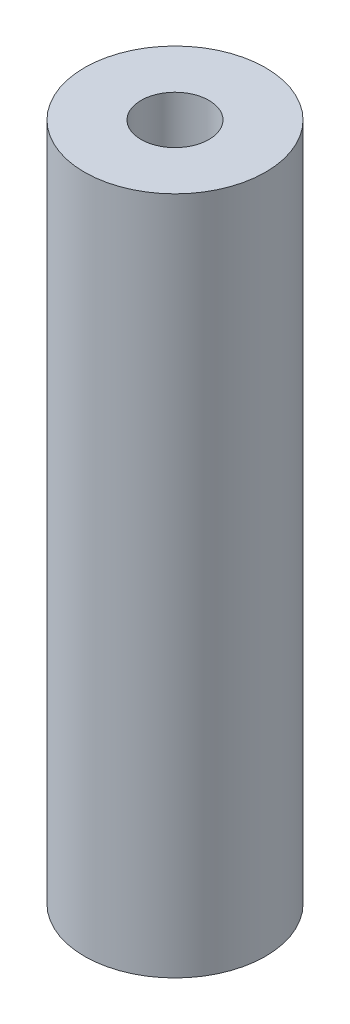
ISO-10303-21;
HEADER;
FILE_DESCRIPTION(('STEP AP214'),'2;1');
FILE_NAME('part.step','',(''),(''),'','','');
FILE_SCHEMA(('AUTOMOTIVE_DESIGN { 1 0 10303 214 1 1 1 1 }'));
ENDSEC;
DATA;
#1=APPLICATION_CONTEXT('core data for automotive mechanical design processes');
#2=APPLICATION_PROTOCOL_DEFINITION('international standard','automotive_design',2000,#1);
#3=PRODUCT_CONTEXT('',#1,'mechanical');
#4=PRODUCT('Part','Part','',(#3));
#5=PRODUCT_RELATED_PRODUCT_CATEGORY('part','',(#4));
#6=PRODUCT_DEFINITION_FORMATION('','',#4);
#7=PRODUCT_DEFINITION_CONTEXT('part definition',#1,'design');
#8=PRODUCT_DEFINITION('design','',#6,#7);
#9=PRODUCT_DEFINITION_SHAPE('','',#8);
#10=(LENGTH_UNIT() NAMED_UNIT(*) SI_UNIT(.MILLI.,.METRE.));
#11=(NAMED_UNIT(*) PLANE_ANGLE_UNIT() SI_UNIT($,.RADIAN.));
#12=(NAMED_UNIT(*) SI_UNIT($,.STERADIAN.) SOLID_ANGLE_UNIT());
#13=UNCERTAINTY_MEASURE_WITH_UNIT(LENGTH_MEASURE(1.E-05),#10,'distance_accuracy_value','');
#14=(GEOMETRIC_REPRESENTATION_CONTEXT(3) GLOBAL_UNCERTAINTY_ASSIGNED_CONTEXT((#13)) GLOBAL_UNIT_ASSIGNED_CONTEXT((#10,
#11,#12)) REPRESENTATION_CONTEXT('',''));
#15=CARTESIAN_POINT('',(0.,0.,0.));
#16=DIRECTION('',(0.,0.,1.));
#17=DIRECTION('',(1.,0.,0.));
#18=AXIS2_PLACEMENT_3D('',#15,#16,#17);
#19=CARTESIAN_POINT('',(0.,30.,0.));
#20=DIRECTION('',(0.,1.,0.));
#21=DIRECTION('',(0.,0.,1.));
#22=AXIS2_PLACEMENT_3D('',#19,#20,#21);
#23=PLANE('',#22);
#24=CARTESIAN_POINT('',(0.,30.,0.));
#25=DIRECTION('',(0.,1.,0.));
#26=DIRECTION('',(0.,0.,1.));
#27=AXIS2_PLACEMENT_3D('',#24,#25,#26);
#28=CIRCLE('',#27,4.);
#29=CARTESIAN_POINT('',(0.,30.,4.));
#30=VERTEX_POINT('',#29);
#31=EDGE_CURVE('E10',#30,#30,#28,.T.);
#32=ORIENTED_EDGE('',*,*,#31,.T.);
#33=EDGE_LOOP('',(#32));
#34=FACE_BOUND('',#33,.T.);
#35=CARTESIAN_POINT('',(0.,30.,0.));
#36=DIRECTION('',(0.,1.,0.));
#37=DIRECTION('',(0.,0.,1.));
#38=AXIS2_PLACEMENT_3D('',#35,#36,#37);
#39=CIRCLE('',#38,1.5);
#40=CARTESIAN_POINT('',(0.,30.,1.5));
#41=VERTEX_POINT('',#40);
#42=EDGE_CURVE('E41',#41,#41,#39,.T.);
#43=ORIENTED_EDGE('',*,*,#42,.F.);
#44=EDGE_LOOP('',(#43));
#45=FACE_BOUND('',#44,.T.);
#46=ADVANCED_FACE('F30',(#34,#45),#23,.T.);
#47=CARTESIAN_POINT('',(0.,0.,0.));
#48=DIRECTION('',(0.,1.,0.));
#49=DIRECTION('',(0.,0.,1.));
#50=AXIS2_PLACEMENT_3D('',#47,#48,#49);
#51=PLANE('',#50);
#52=CARTESIAN_POINT('',(0.,0.,0.));
#53=DIRECTION('',(0.,1.,0.));
#54=DIRECTION('',(0.,0.,1.));
#55=AXIS2_PLACEMENT_3D('',#52,#53,#54);
#56=CIRCLE('',#55,4.);
#57=CARTESIAN_POINT('',(0.,0.,4.));
#58=VERTEX_POINT('',#57);
#59=EDGE_CURVE('E34',#58,#58,#56,.T.);
#60=ORIENTED_EDGE('',*,*,#59,.F.);
#61=EDGE_LOOP('',(#60));
#62=FACE_BOUND('',#61,.T.);
#63=CARTESIAN_POINT('',(0.,0.,0.));
#64=DIRECTION('',(0.,1.,0.));
#65=DIRECTION('',(0.,0.,1.));
#66=AXIS2_PLACEMENT_3D('',#63,#64,#65);
#67=CIRCLE('',#66,1.5);
#68=CARTESIAN_POINT('',(0.,0.,1.5));
#69=VERTEX_POINT('',#68);
#70=EDGE_CURVE('E43',#69,#69,#67,.T.);
#71=ORIENTED_EDGE('',*,*,#70,.T.);
#72=EDGE_LOOP('',(#71));
#73=FACE_BOUND('',#72,.T.);
#74=ADVANCED_FACE('F53',(#62,#73),#51,.F.);
#75=CARTESIAN_POINT('',(0.,30.,0.));
#76=DIRECTION('',(0.,-1.,0.));
#77=DIRECTION('',(0.,0.,-1.));
#78=AXIS2_PLACEMENT_3D('',#75,#76,#77);
#79=CYLINDRICAL_SURFACE('',#78,4.);
#80=ORIENTED_EDGE('',*,*,#31,.F.);
#81=EDGE_LOOP('',(#80));
#82=FACE_BOUND('',#81,.T.);
#83=ORIENTED_EDGE('',*,*,#59,.T.);
#84=EDGE_LOOP('',(#83));
#85=FACE_BOUND('',#84,.T.);
#86=ADVANCED_FACE('F32',(#82,#85),#79,.T.);
#87=CARTESIAN_POINT('',(0.,30.,0.));
#88=DIRECTION('',(0.,-1.,0.));
#89=DIRECTION('',(0.,0.,-1.));
#90=AXIS2_PLACEMENT_3D('',#87,#88,#89);
#91=CYLINDRICAL_SURFACE('',#90,1.5);
#92=ORIENTED_EDGE('',*,*,#42,.T.);
#93=EDGE_LOOP('',(#92));
#94=FACE_BOUND('',#93,.T.);
#95=ORIENTED_EDGE('',*,*,#70,.F.);
#96=EDGE_LOOP('',(#95));
#97=FACE_BOUND('',#96,.T.);
#98=ADVANCED_FACE('F49',(#94,#97),#91,.F.);
#99=CLOSED_SHELL('',(#46,#74,#86,#98));
#100=MANIFOLD_SOLID_BREP('B2',#99);
#101=ADVANCED_BREP_SHAPE_REPRESENTATION('',(#18,#100),#14);
#102=SHAPE_DEFINITION_REPRESENTATION(#9,#101);
ENDSEC;
END-ISO-10303-21;
